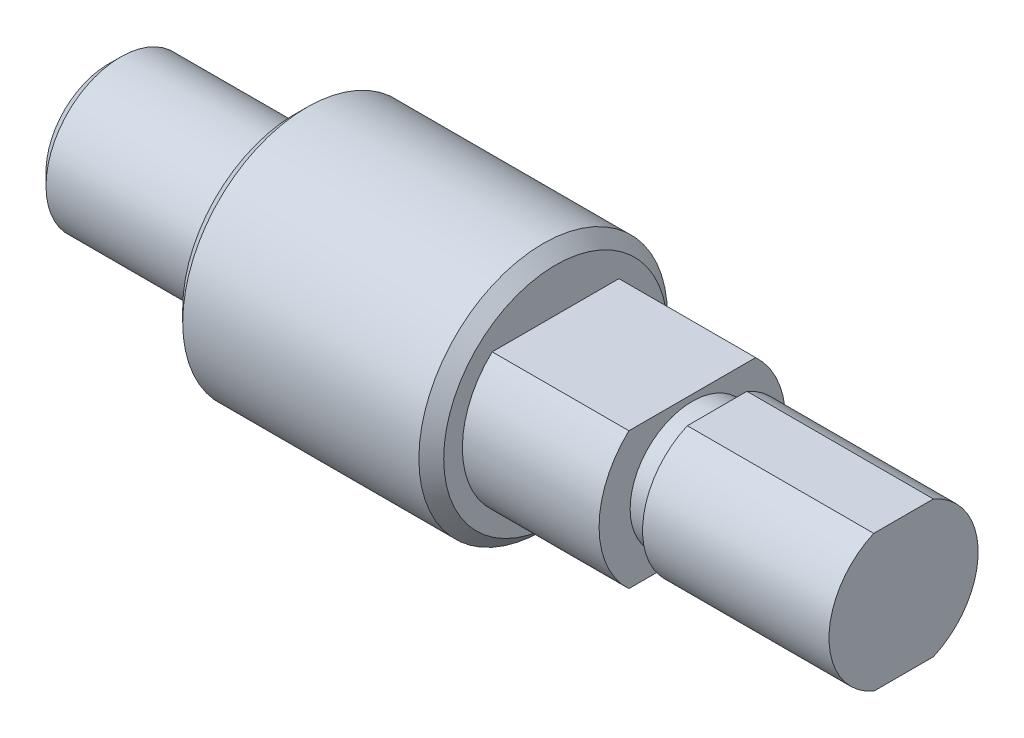
ISO-10303-21;
HEADER;
FILE_DESCRIPTION(('STEP AP214'),'2;1');
FILE_NAME('part.step','',(''),(''),'','','');
FILE_SCHEMA(('AUTOMOTIVE_DESIGN { 1 0 10303 214 1 1 1 1 }'));
ENDSEC;
DATA;
#1=APPLICATION_CONTEXT('core data for automotive mechanical design processes');
#2=APPLICATION_PROTOCOL_DEFINITION('international standard','automotive_design',2000,#1);
#3=PRODUCT_CONTEXT('',#1,'mechanical');
#4=PRODUCT('Part','Part','',(#3));
#5=PRODUCT_RELATED_PRODUCT_CATEGORY('part','',(#4));
#6=PRODUCT_DEFINITION_FORMATION('','',#4);
#7=PRODUCT_DEFINITION_CONTEXT('part definition',#1,'design');
#8=PRODUCT_DEFINITION('design','',#6,#7);
#9=PRODUCT_DEFINITION_SHAPE('','',#8);
#10=(LENGTH_UNIT() NAMED_UNIT(*) SI_UNIT(.MILLI.,.METRE.));
#11=(NAMED_UNIT(*) PLANE_ANGLE_UNIT() SI_UNIT($,.RADIAN.));
#12=(NAMED_UNIT(*) SI_UNIT($,.STERADIAN.) SOLID_ANGLE_UNIT());
#13=UNCERTAINTY_MEASURE_WITH_UNIT(LENGTH_MEASURE(1.E-05),#10,'distance_accuracy_value','');
#14=(GEOMETRIC_REPRESENTATION_CONTEXT(3) GLOBAL_UNCERTAINTY_ASSIGNED_CONTEXT((#13)) GLOBAL_UNIT_ASSIGNED_CONTEXT((#10,
#11,#12)) REPRESENTATION_CONTEXT('',''));
#15=CARTESIAN_POINT('',(0.,0.,0.));
#16=DIRECTION('',(0.,0.,1.));
#17=DIRECTION('',(1.,0.,0.));
#18=AXIS2_PLACEMENT_3D('',#15,#16,#17);
#19=CARTESIAN_POINT('',(1180.7086359668,1047.37742950609,0.));
#20=DIRECTION('',(-1.,0.,0.));
#21=DIRECTION('',(0.,0.,1.));
#22=AXIS2_PLACEMENT_3D('',#19,#20,#21);
#23=CYLINDRICAL_SURFACE('',#22,6.00000000000001);
#24=CARTESIAN_POINT('',(1247.122729102,1047.37742950609,0.));
#25=DIRECTION('',(-1.,0.,0.));
#26=DIRECTION('',(0.,0.,1.));
#27=AXIS2_PLACEMENT_3D('',#24,#25,#26);
#28=CIRCLE('',#27,6.00000000000001);
#29=CARTESIAN_POINT('',(1247.122729102,1052.87742950609,-2.39791576165623));
#30=VERTEX_POINT('',#29);
#31=CARTESIAN_POINT('',(1247.122729102,1041.87742950609,-2.39791576165623));
#32=VERTEX_POINT('',#31);
#33=EDGE_CURVE('E141',#30,#32,#28,.T.);
#34=ORIENTED_EDGE('',*,*,#33,.T.);
#35=DIRECTION('',(-1.,0.,0.));
#36=VECTOR('',#35,1.);
#37=CARTESIAN_POINT('',(1180.7086359668,1041.87742950609,-2.39791576165623));
#38=LINE('',#37,#36);
#39=CARTESIAN_POINT('',(1232.122729102,1041.87742950609,-2.39791576165623));
#40=VERTEX_POINT('',#39);
#41=EDGE_CURVE('E426',#32,#40,#38,.T.);
#42=ORIENTED_EDGE('',*,*,#41,.T.);
#43=CARTESIAN_POINT('',(1232.122729102,1047.37742950609,0.));
#44=DIRECTION('',(-1.,0.,0.));
#45=DIRECTION('',(0.,0.,1.));
#46=AXIS2_PLACEMENT_3D('',#43,#44,#45);
#47=CIRCLE('',#46,6.00000000000001);
#48=CARTESIAN_POINT('',(1232.122729102,1052.87742950609,-2.39791576165623));
#49=VERTEX_POINT('',#48);
#50=EDGE_CURVE('E137',#49,#40,#47,.T.);
#51=ORIENTED_EDGE('',*,*,#50,.F.);
#52=DIRECTION('',(-1.,0.,0.));
#53=VECTOR('',#52,1.);
#54=CARTESIAN_POINT('',(1180.7086359668,1052.87742950609,-2.39791576165623));
#55=LINE('',#54,#53);
#56=EDGE_CURVE('E206',#49,#30,#55,.F.);
#57=ORIENTED_EDGE('',*,*,#56,.T.);
#58=EDGE_LOOP('',(#34,#42,#51,#57));
#59=FACE_BOUND('',#58,.T.);
#60=ADVANCED_FACE('F32',(#59),#23,.T.);
#61=CARTESIAN_POINT('',(1180.7086359668,1047.37742950609,0.));
#62=DIRECTION('',(-1.,0.,0.));
#63=DIRECTION('',(0.,0.,1.));
#64=AXIS2_PLACEMENT_3D('',#61,#62,#63);
#65=CYLINDRICAL_SURFACE('',#64,7.50000000000006);
#66=CARTESIAN_POINT('',(1230.122729102,1047.37742950609,0.));
#67=DIRECTION('',(-1.,0.,0.));
#68=DIRECTION('',(0.,0.,1.));
#69=AXIS2_PLACEMENT_3D('',#66,#67,#68);
#70=CIRCLE('',#69,7.50000000000006);
#71=CARTESIAN_POINT('',(1230.122729102,1052.87742950609,-5.09901951359281));
#72=VERTEX_POINT('',#71);
#73=CARTESIAN_POINT('',(1230.122729102,1041.87742950609,-5.09901951359281));
#74=VERTEX_POINT('',#73);
#75=EDGE_CURVE('E114',#72,#74,#70,.T.);
#76=ORIENTED_EDGE('',*,*,#75,.T.);
#77=DIRECTION('',(-1.,0.,0.));
#78=VECTOR('',#77,1.);
#79=CARTESIAN_POINT('',(1180.7086359668,1041.87742950609,-5.09901951359281));
#80=LINE('',#79,#78);
#81=CARTESIAN_POINT('',(1219.122729102,1041.87742950609,-5.09901951359281));
#82=VERTEX_POINT('',#81);
#83=EDGE_CURVE('E101',#74,#82,#80,.T.);
#84=ORIENTED_EDGE('',*,*,#83,.T.);
#85=CARTESIAN_POINT('',(1219.122729102,1047.37742950609,0.));
#86=DIRECTION('',(-1.,0.,0.));
#87=DIRECTION('',(0.,0.,1.));
#88=AXIS2_PLACEMENT_3D('',#85,#86,#87);
#89=CIRCLE('',#88,7.50000000000006);
#90=CARTESIAN_POINT('',(1219.122729102,1052.87742950609,-5.09901951359281));
#91=VERTEX_POINT('',#90);
#92=EDGE_CURVE('E112',#91,#82,#89,.T.);
#93=ORIENTED_EDGE('',*,*,#92,.F.);
#94=DIRECTION('',(-1.,0.,0.));
#95=VECTOR('',#94,1.);
#96=CARTESIAN_POINT('',(1180.7086359668,1052.87742950609,-5.09901951359281));
#97=LINE('',#96,#95);
#98=EDGE_CURVE('E421',#91,#72,#97,.F.);
#99=ORIENTED_EDGE('',*,*,#98,.T.);
#100=EDGE_LOOP('',(#76,#84,#93,#99));
#101=FACE_BOUND('',#100,.T.);
#102=ADVANCED_FACE('F110',(#101),#65,.T.);
#103=CARTESIAN_POINT('',(1183.122729102,1053.37742950609,0.));
#104=DIRECTION('',(1.,0.,0.));
#105=DIRECTION('',(0.,0.,-1.));
#106=AXIS2_PLACEMENT_3D('',#103,#104,#105);
#107=PLANE('',#106);
#108=CARTESIAN_POINT('',(1183.122729102,1047.37742950609,0.));
#109=DIRECTION('',(1.,0.,0.));
#110=DIRECTION('',(0.,0.,-1.));
#111=AXIS2_PLACEMENT_3D('',#108,#109,#110);
#112=CIRCLE('',#111,5.00000000000014);
#113=CARTESIAN_POINT('',(1183.122729102,1047.37742950609,-5.00000000000014));
#114=VERTEX_POINT('',#113);
#115=EDGE_CURVE('E40',#114,#114,#112,.F.);
#116=ORIENTED_EDGE('',*,*,#115,.T.);
#117=EDGE_LOOP('',(#116));
#118=FACE_BOUND('',#117,.T.);
#119=CARTESIAN_POINT('',(1183.122729102,1047.37742950609,0.));
#120=DIRECTION('',(-1.,0.,0.));
#121=DIRECTION('',(0.,0.,1.));
#122=AXIS2_PLACEMENT_3D('',#119,#120,#121);
#123=CIRCLE('',#122,2.49999999999995);
#124=CARTESIAN_POINT('',(1183.122729102,1047.37742950609,2.49999999999995));
#125=VERTEX_POINT('',#124);
#126=EDGE_CURVE('E147',#125,#125,#123,.T.);
#127=ORIENTED_EDGE('',*,*,#126,.F.);
#128=EDGE_LOOP('',(#127));
#129=FACE_BOUND('',#128,.T.);
#130=ADVANCED_FACE('F152',(#118,#129),#107,.F.);
#131=CARTESIAN_POINT('',(1180.7086359668,1047.37742950609,0.));
#132=DIRECTION('',(-1.,0.,0.));
#133=DIRECTION('',(0.,0.,1.));
#134=AXIS2_PLACEMENT_3D('',#131,#132,#133);
#135=CYLINDRICAL_SURFACE('',#134,2.49999999999995);
#136=CARTESIAN_POINT('',(1196.06260392681,1047.37742950609,0.));
#137=DIRECTION('',(-1.,0.,0.));
#138=DIRECTION('',(0.,0.,1.));
#139=AXIS2_PLACEMENT_3D('',#136,#137,#138);
#140=CIRCLE('',#139,2.49999999999995);
#141=CARTESIAN_POINT('',(1196.06260392681,1047.37742950609,2.49999999999995));
#142=VERTEX_POINT('',#141);
#143=EDGE_CURVE('E144',#142,#142,#140,.T.);
#144=ORIENTED_EDGE('',*,*,#143,.F.);
#145=EDGE_LOOP('',(#144));
#146=FACE_BOUND('',#145,.T.);
#147=ORIENTED_EDGE('',*,*,#126,.T.);
#148=EDGE_LOOP('',(#147));
#149=FACE_BOUND('',#148,.T.);
#150=ADVANCED_FACE('F383',(#146,#149),#135,.F.);
#151=CARTESIAN_POINT('',(1196.06260392681,1047.37742950609,0.));
#152=DIRECTION('',(-1.,0.,0.));
#153=DIRECTION('',(0.,0.,1.));
#154=AXIS2_PLACEMENT_3D('',#151,#152,#153);
#155=CONICAL_SURFACE('',#154,2.49999999999995,0.585218180482622);
#156=CARTESIAN_POINT('',(1199.83532230931,1047.37742950609,0.));
#157=VERTEX_POINT('',#156);
#158=VERTEX_LOOP('',#157);
#159=FACE_BOUND('',#158,.T.);
#160=ORIENTED_EDGE('',*,*,#143,.T.);
#161=EDGE_LOOP('',(#160));
#162=FACE_BOUND('',#161,.T.);
#163=ADVANCED_FACE('F191',(#159,#162),#155,.F.);
#164=CARTESIAN_POINT('',(1247.122729102,1053.37742950609,0.));
#165=DIRECTION('',(-1.,0.,0.));
#166=DIRECTION('',(0.,0.,1.));
#167=AXIS2_PLACEMENT_3D('',#164,#165,#166);
#168=PLANE('',#167);
#169=CARTESIAN_POINT('',(1247.122729102,1041.87742950609,2.39791576165623));
#170=VERTEX_POINT('',#169);
#171=CARTESIAN_POINT('',(1247.122729102,1052.87742950609,2.39791576165623));
#172=VERTEX_POINT('',#171);
#173=EDGE_CURVE('E140',#170,#172,#28,.T.);
#174=ORIENTED_EDGE('',*,*,#173,.F.);
#175=DIRECTION('',(0.,0.,-1.));
#176=VECTOR('',#175,1.);
#177=CARTESIAN_POINT('',(1247.122729102,1041.87742950609,0.));
#178=LINE('',#177,#176);
#179=EDGE_CURVE('E422',#170,#32,#178,.T.);
#180=ORIENTED_EDGE('',*,*,#179,.T.);
#181=ORIENTED_EDGE('',*,*,#33,.F.);
#182=DIRECTION('',(0.,0.,1.));
#183=VECTOR('',#182,1.);
#184=CARTESIAN_POINT('',(1247.122729102,1052.87742950609,0.));
#185=LINE('',#184,#183);
#186=EDGE_CURVE('E216',#30,#172,#185,.T.);
#187=ORIENTED_EDGE('',*,*,#186,.T.);
#188=EDGE_LOOP('',(#174,#180,#181,#187));
#189=FACE_BOUND('',#188,.T.);
#190=ADVANCED_FACE('F183',(#189),#168,.F.);
#191=CARTESIAN_POINT('',(1232.122729102,1041.87742950609,2.39791576165623));
#192=VERTEX_POINT('',#191);
#193=CARTESIAN_POINT('',(1232.122729102,1052.87742950609,2.39791576165623));
#194=VERTEX_POINT('',#193);
#195=EDGE_CURVE('E136',#192,#194,#47,.T.);
#196=ORIENTED_EDGE('',*,*,#195,.F.);
#197=DIRECTION('',(-1.,0.,0.));
#198=VECTOR('',#197,1.);
#199=CARTESIAN_POINT('',(1180.7086359668,1041.87742950609,2.39791576165623));
#200=LINE('',#199,#198);
#201=EDGE_CURVE('E47',#192,#170,#200,.F.);
#202=ORIENTED_EDGE('',*,*,#201,.T.);
#203=ORIENTED_EDGE('',*,*,#173,.T.);
#204=DIRECTION('',(-1.,0.,0.));
#205=VECTOR('',#204,1.);
#206=CARTESIAN_POINT('',(1180.7086359668,1052.87742950609,2.39791576165623));
#207=LINE('',#206,#205);
#208=EDGE_CURVE('E197',#172,#194,#207,.T.);
#209=ORIENTED_EDGE('',*,*,#208,.T.);
#210=EDGE_LOOP('',(#196,#202,#203,#209));
#211=FACE_BOUND('',#210,.T.);
#212=ADVANCED_FACE('F173',(#211),#23,.T.);
#213=CARTESIAN_POINT('',(1232.122729102,1053.37742950609,0.));
#214=DIRECTION('',(1.,0.,0.));
#215=DIRECTION('',(0.,0.,-1.));
#216=AXIS2_PLACEMENT_3D('',#213,#214,#215);
#217=PLANE('',#216);
#218=CARTESIAN_POINT('',(1232.122729102,1047.37742950609,0.));
#219=DIRECTION('',(-1.,0.,0.));
#220=DIRECTION('',(0.,0.,1.));
#221=AXIS2_PLACEMENT_3D('',#218,#219,#220);
#222=CIRCLE('',#221,4.99999999999989);
#223=CARTESIAN_POINT('',(1232.122729102,1047.37742950609,4.99999999999989));
#224=VERTEX_POINT('',#223);
#225=EDGE_CURVE('E133',#224,#224,#222,.T.);
#226=ORIENTED_EDGE('',*,*,#225,.F.);
#227=EDGE_LOOP('',(#226));
#228=FACE_BOUND('',#227,.T.);
#229=ORIENTED_EDGE('',*,*,#50,.T.);
#230=DIRECTION('',(0.,0.,1.));
#231=VECTOR('',#230,1.);
#232=CARTESIAN_POINT('',(1232.122729102,1041.87742950609,0.));
#233=LINE('',#232,#231);
#234=EDGE_CURVE('E115',#40,#192,#233,.T.);
#235=ORIENTED_EDGE('',*,*,#234,.T.);
#236=ORIENTED_EDGE('',*,*,#195,.T.);
#237=DIRECTION('',(0.,0.,-1.));
#238=VECTOR('',#237,1.);
#239=CARTESIAN_POINT('',(1232.122729102,1052.87742950609,0.));
#240=LINE('',#239,#238);
#241=EDGE_CURVE('E201',#194,#49,#240,.T.);
#242=ORIENTED_EDGE('',*,*,#241,.T.);
#243=EDGE_LOOP('',(#229,#235,#236,#242));
#244=FACE_BOUND('',#243,.T.);
#245=ADVANCED_FACE('F182',(#228,#244),#217,.F.);
#246=CARTESIAN_POINT('',(1180.7086359668,1047.37742950609,0.));
#247=DIRECTION('',(-1.,0.,0.));
#248=DIRECTION('',(0.,0.,1.));
#249=AXIS2_PLACEMENT_3D('',#246,#247,#248);
#250=CYLINDRICAL_SURFACE('',#249,4.99999999999989);
#251=CARTESIAN_POINT('',(1230.122729102,1047.37742950609,0.));
#252=DIRECTION('',(-1.,0.,0.));
#253=DIRECTION('',(0.,0.,1.));
#254=AXIS2_PLACEMENT_3D('',#251,#252,#253);
#255=CIRCLE('',#254,4.99999999999989);
#256=CARTESIAN_POINT('',(1230.122729102,1047.37742950609,4.99999999999989));
#257=VERTEX_POINT('',#256);
#258=EDGE_CURVE('E130',#257,#257,#255,.T.);
#259=ORIENTED_EDGE('',*,*,#258,.F.);
#260=EDGE_LOOP('',(#259));
#261=FACE_BOUND('',#260,.T.);
#262=ORIENTED_EDGE('',*,*,#225,.T.);
#263=EDGE_LOOP('',(#262));
#264=FACE_BOUND('',#263,.T.);
#265=ADVANCED_FACE('F189',(#261,#264),#250,.T.);
#266=CARTESIAN_POINT('',(1230.122729102,1054.87742950609,0.));
#267=DIRECTION('',(-1.,0.,0.));
#268=DIRECTION('',(0.,0.,1.));
#269=AXIS2_PLACEMENT_3D('',#266,#267,#268);
#270=PLANE('',#269);
#271=CARTESIAN_POINT('',(1230.122729102,1041.87742950609,5.09901951359281));
#272=VERTEX_POINT('',#271);
#273=CARTESIAN_POINT('',(1230.122729102,1052.87742950609,5.09901951359281));
#274=VERTEX_POINT('',#273);
#275=EDGE_CURVE('E122',#272,#274,#70,.T.);
#276=ORIENTED_EDGE('',*,*,#275,.F.);
#277=DIRECTION('',(0.,0.,-1.));
#278=VECTOR('',#277,1.);
#279=CARTESIAN_POINT('',(1230.122729102,1041.87742950609,0.));
#280=LINE('',#279,#278);
#281=EDGE_CURVE('E55',#272,#74,#280,.T.);
#282=ORIENTED_EDGE('',*,*,#281,.T.);
#283=ORIENTED_EDGE('',*,*,#75,.F.);
#284=DIRECTION('',(0.,0.,1.));
#285=VECTOR('',#284,1.);
#286=CARTESIAN_POINT('',(1230.122729102,1052.87742950609,0.));
#287=LINE('',#286,#285);
#288=EDGE_CURVE('E211',#72,#274,#287,.T.);
#289=ORIENTED_EDGE('',*,*,#288,.T.);
#290=EDGE_LOOP('',(#276,#282,#283,#289));
#291=FACE_BOUND('',#290,.T.);
#292=ORIENTED_EDGE('',*,*,#258,.T.);
#293=EDGE_LOOP('',(#292));
#294=FACE_BOUND('',#293,.T.);
#295=ADVANCED_FACE('F243',(#291,#294),#270,.F.);
#296=CARTESIAN_POINT('',(1219.122729102,1041.87742950609,5.09901951359281));
#297=VERTEX_POINT('',#296);
#298=CARTESIAN_POINT('',(1219.122729102,1052.87742950609,5.09901951359281));
#299=VERTEX_POINT('',#298);
#300=EDGE_CURVE('E123',#297,#299,#89,.T.);
#301=ORIENTED_EDGE('',*,*,#300,.F.);
#302=DIRECTION('',(-1.,0.,0.));
#303=VECTOR('',#302,1.);
#304=CARTESIAN_POINT('',(1180.7086359668,1041.87742950609,5.09901951359281));
#305=LINE('',#304,#303);
#306=EDGE_CURVE('E102',#297,#272,#305,.F.);
#307=ORIENTED_EDGE('',*,*,#306,.T.);
#308=ORIENTED_EDGE('',*,*,#275,.T.);
#309=DIRECTION('',(-1.,0.,0.));
#310=VECTOR('',#309,1.);
#311=CARTESIAN_POINT('',(1180.7086359668,1052.87742950609,5.09901951359281));
#312=LINE('',#311,#310);
#313=EDGE_CURVE('E207',#274,#299,#312,.T.);
#314=ORIENTED_EDGE('',*,*,#313,.T.);
#315=EDGE_LOOP('',(#301,#307,#308,#314));
#316=FACE_BOUND('',#315,.T.);
#317=ADVANCED_FACE('F178',(#316),#65,.T.);
#318=CARTESIAN_POINT('',(1219.122729102,1056.37742950609,0.));
#319=DIRECTION('',(-1.,0.,0.));
#320=DIRECTION('',(0.,0.,1.));
#321=AXIS2_PLACEMENT_3D('',#318,#319,#320);
#322=PLANE('',#321);
#323=ORIENTED_EDGE('',*,*,#92,.T.);
#324=DIRECTION('',(0.,0.,1.));
#325=VECTOR('',#324,1.);
#326=CARTESIAN_POINT('',(1219.122729102,1041.87742950609,-25.));
#327=LINE('',#326,#325);
#328=EDGE_CURVE('E98',#82,#297,#327,.T.);
#329=ORIENTED_EDGE('',*,*,#328,.T.);
#330=ORIENTED_EDGE('',*,*,#300,.T.);
#331=DIRECTION('',(0.,0.,1.));
#332=VECTOR('',#331,1.);
#333=CARTESIAN_POINT('',(1219.122729102,1052.87742950609,-25.));
#334=LINE('',#333,#332);
#335=EDGE_CURVE('E120',#91,#299,#334,.T.);
#336=ORIENTED_EDGE('',*,*,#335,.F.);
#337=EDGE_LOOP('',(#323,#329,#330,#336));
#338=FACE_BOUND('',#337,.T.);
#339=CARTESIAN_POINT('',(1219.122729102,1047.37742950609,0.));
#340=DIRECTION('',(-1.,0.,0.));
#341=DIRECTION('',(0.,0.,1.));
#342=AXIS2_PLACEMENT_3D('',#339,#340,#341);
#343=CIRCLE('',#342,9.00000000000012);
#344=CARTESIAN_POINT('',(1219.122729102,1047.37742950609,9.00000000000012));
#345=VERTEX_POINT('',#344);
#346=EDGE_CURVE('E126',#345,#345,#343,.T.);
#347=ORIENTED_EDGE('',*,*,#346,.F.);
#348=EDGE_LOOP('',(#347));
#349=FACE_BOUND('',#348,.T.);
#350=ADVANCED_FACE('F117',(#338,#349),#322,.F.);
#351=CARTESIAN_POINT('',(1219.122729102,1047.37742950609,0.));
#352=DIRECTION('',(-1.,0.,0.));
#353=DIRECTION('',(0.,0.,1.));
#354=AXIS2_PLACEMENT_3D('',#351,#352,#353);
#355=CONICAL_SURFACE('',#354,9.00000000000012,0.785398163397448);
#356=CARTESIAN_POINT('',(1218.122729102,1047.37742950609,0.));
#357=DIRECTION('',(-1.,0.,0.));
#358=DIRECTION('',(0.,0.,1.));
#359=AXIS2_PLACEMENT_3D('',#356,#357,#358);
#360=CIRCLE('',#359,10.0000000000002);
#361=CARTESIAN_POINT('',(1218.122729102,1047.37742950609,10.0000000000002));
#362=VERTEX_POINT('',#361);
#363=EDGE_CURVE('E226',#362,#362,#360,.T.);
#364=ORIENTED_EDGE('',*,*,#363,.F.);
#365=EDGE_LOOP('',(#364));
#366=FACE_BOUND('',#365,.T.);
#367=ORIENTED_EDGE('',*,*,#346,.T.);
#368=EDGE_LOOP('',(#367));
#369=FACE_BOUND('',#368,.T.);
#370=ADVANCED_FACE('F233',(#366,#369),#355,.T.);
#371=CARTESIAN_POINT('',(1180.7086359668,1047.37742950609,0.));
#372=DIRECTION('',(-1.,0.,0.));
#373=DIRECTION('',(0.,0.,1.));
#374=AXIS2_PLACEMENT_3D('',#371,#372,#373);
#375=CYLINDRICAL_SURFACE('',#374,10.0000000000002);
#376=CARTESIAN_POINT('',(1199.122729102,1047.37742950609,0.));
#377=DIRECTION('',(-1.,0.,0.));
#378=DIRECTION('',(0.,0.,1.));
#379=AXIS2_PLACEMENT_3D('',#376,#377,#378);
#380=CIRCLE('',#379,10.0000000000002);
#381=CARTESIAN_POINT('',(1199.122729102,1047.37742950609,10.0000000000002));
#382=VERTEX_POINT('',#381);
#383=EDGE_CURVE('E224',#382,#382,#380,.T.);
#384=ORIENTED_EDGE('',*,*,#383,.F.);
#385=EDGE_LOOP('',(#384));
#386=FACE_BOUND('',#385,.T.);
#387=ORIENTED_EDGE('',*,*,#363,.T.);
#388=EDGE_LOOP('',(#387));
#389=FACE_BOUND('',#388,.T.);
#390=ADVANCED_FACE('F240',(#386,#389),#375,.T.);
#391=CARTESIAN_POINT('',(1199.122729102,1047.37742950609,0.));
#392=DIRECTION('',(1.,0.,0.));
#393=DIRECTION('',(0.,0.,-1.));
#394=AXIS2_PLACEMENT_3D('',#391,#392,#393);
#395=CONICAL_SURFACE('',#394,10.0000000000002,0.785398163397448);
#396=CARTESIAN_POINT('',(1198.122729102,1047.37742950609,0.));
#397=DIRECTION('',(-1.,0.,0.));
#398=DIRECTION('',(0.,0.,1.));
#399=AXIS2_PLACEMENT_3D('',#396,#397,#398);
#400=CIRCLE('',#399,9.00000000000012);
#401=CARTESIAN_POINT('',(1198.122729102,1047.37742950609,9.00000000000012));
#402=VERTEX_POINT('',#401);
#403=EDGE_CURVE('E221',#402,#402,#400,.T.);
#404=ORIENTED_EDGE('',*,*,#403,.F.);
#405=EDGE_LOOP('',(#404));
#406=FACE_BOUND('',#405,.T.);
#407=ORIENTED_EDGE('',*,*,#383,.T.);
#408=EDGE_LOOP('',(#407));
#409=FACE_BOUND('',#408,.T.);
#410=ADVANCED_FACE('F320',(#406,#409),#395,.T.);
#411=CARTESIAN_POINT('',(1198.122729102,1056.37742950609,0.));
#412=DIRECTION('',(1.,0.,0.));
#413=DIRECTION('',(0.,0.,-1.));
#414=AXIS2_PLACEMENT_3D('',#411,#412,#413);
#415=PLANE('',#414);
#416=CARTESIAN_POINT('',(1198.122729102,1047.37742950609,0.));
#417=DIRECTION('',(-1.,0.,0.));
#418=DIRECTION('',(0.,0.,1.));
#419=AXIS2_PLACEMENT_3D('',#416,#417,#418);
#420=CIRCLE('',#419,6.00000000000001);
#421=CARTESIAN_POINT('',(1198.122729102,1047.37742950609,6.00000000000001));
#422=VERTEX_POINT('',#421);
#423=EDGE_CURVE('E218',#422,#422,#420,.T.);
#424=ORIENTED_EDGE('',*,*,#423,.F.);
#425=EDGE_LOOP('',(#424));
#426=FACE_BOUND('',#425,.T.);
#427=ORIENTED_EDGE('',*,*,#403,.T.);
#428=EDGE_LOOP('',(#427));
#429=FACE_BOUND('',#428,.T.);
#430=ADVANCED_FACE('F166',(#426,#429),#415,.F.);
#431=CARTESIAN_POINT('',(1180.7086359668,1047.37742950609,0.));
#432=DIRECTION('',(-1.,0.,0.));
#433=DIRECTION('',(0.,0.,1.));
#434=AXIS2_PLACEMENT_3D('',#431,#432,#433);
#435=CYLINDRICAL_SURFACE('',#434,6.00000000000001);
#436=CARTESIAN_POINT('',(1184.122729102,1047.37742950609,0.));
#437=DIRECTION('',(1.,0.,0.));
#438=DIRECTION('',(0.,0.,-1.));
#439=AXIS2_PLACEMENT_3D('',#436,#437,#438);
#440=CIRCLE('',#439,6.00000000000001);
#441=CARTESIAN_POINT('',(1184.122729102,1047.37742950609,-6.00000000000001));
#442=VERTEX_POINT('',#441);
#443=EDGE_CURVE('E11',#442,#442,#440,.T.);
#444=ORIENTED_EDGE('',*,*,#443,.T.);
#445=EDGE_LOOP('',(#444));
#446=FACE_BOUND('',#445,.T.);
#447=ORIENTED_EDGE('',*,*,#423,.T.);
#448=EDGE_LOOP('',(#447));
#449=FACE_BOUND('',#448,.T.);
#450=ADVANCED_FACE('F157',(#446,#449),#435,.T.);
#451=CARTESIAN_POINT('',(1183.122729102,1047.37742950609,0.));
#452=DIRECTION('',(1.,0.,0.));
#453=DIRECTION('',(0.,0.,-1.));
#454=AXIS2_PLACEMENT_3D('',#451,#452,#453);
#455=CONICAL_SURFACE('',#454,5.00000000000014,0.785398163397434);
#456=ORIENTED_EDGE('',*,*,#443,.F.);
#457=EDGE_LOOP('',(#456));
#458=FACE_BOUND('',#457,.T.);
#459=ORIENTED_EDGE('',*,*,#115,.F.);
#460=EDGE_LOOP('',(#459));
#461=FACE_BOUND('',#460,.T.);
#462=ADVANCED_FACE('F34',(#458,#461),#455,.T.);
#463=CARTESIAN_POINT('',(1251.28538359321,1052.87742950609,-25.));
#464=DIRECTION('',(0.,-1.,0.));
#465=DIRECTION('',(0.,0.,-1.));
#466=AXIS2_PLACEMENT_3D('',#463,#464,#465);
#467=PLANE('',#466);
#468=ORIENTED_EDGE('',*,*,#288,.F.);
#469=ORIENTED_EDGE('',*,*,#98,.F.);
#470=ORIENTED_EDGE('',*,*,#335,.T.);
#471=ORIENTED_EDGE('',*,*,#313,.F.);
#472=EDGE_LOOP('',(#468,#469,#470,#471));
#473=FACE_BOUND('',#472,.T.);
#474=ADVANCED_FACE('F156',(#473),#467,.F.);
#475=ORIENTED_EDGE('',*,*,#56,.F.);
#476=ORIENTED_EDGE('',*,*,#241,.F.);
#477=ORIENTED_EDGE('',*,*,#208,.F.);
#478=ORIENTED_EDGE('',*,*,#186,.F.);
#479=EDGE_LOOP('',(#475,#476,#477,#478));
#480=FACE_BOUND('',#479,.T.);
#481=ADVANCED_FACE('F163',(#480),#467,.F.);
#482=CARTESIAN_POINT('',(1251.28538359321,1041.87742950609,-25.));
#483=DIRECTION('',(0.,1.,0.));
#484=DIRECTION('',(0.,0.,1.));
#485=AXIS2_PLACEMENT_3D('',#482,#483,#484);
#486=PLANE('',#485);
#487=ORIENTED_EDGE('',*,*,#281,.F.);
#488=ORIENTED_EDGE('',*,*,#306,.F.);
#489=ORIENTED_EDGE('',*,*,#328,.F.);
#490=ORIENTED_EDGE('',*,*,#83,.F.);
#491=EDGE_LOOP('',(#487,#488,#489,#490));
#492=FACE_BOUND('',#491,.T.);
#493=ADVANCED_FACE('F100',(#492),#486,.F.);
#494=ORIENTED_EDGE('',*,*,#201,.F.);
#495=ORIENTED_EDGE('',*,*,#234,.F.);
#496=ORIENTED_EDGE('',*,*,#41,.F.);
#497=ORIENTED_EDGE('',*,*,#179,.F.);
#498=EDGE_LOOP('',(#494,#495,#496,#497));
#499=FACE_BOUND('',#498,.T.);
#500=ADVANCED_FACE('F306',(#499),#486,.F.);
#501=CLOSED_SHELL('',(#60,#102,#130,#150,#163,#190,#212,#245,#265,#295,#317,#350,#370,#390,#410,
#430,#450,#462,#474,#481,#493,#500));
#502=MANIFOLD_SOLID_BREP('B2',#501);
#503=ADVANCED_BREP_SHAPE_REPRESENTATION('',(#18,#502),#14);
#504=SHAPE_DEFINITION_REPRESENTATION(#9,#503);
ENDSEC;
END-ISO-10303-21;
